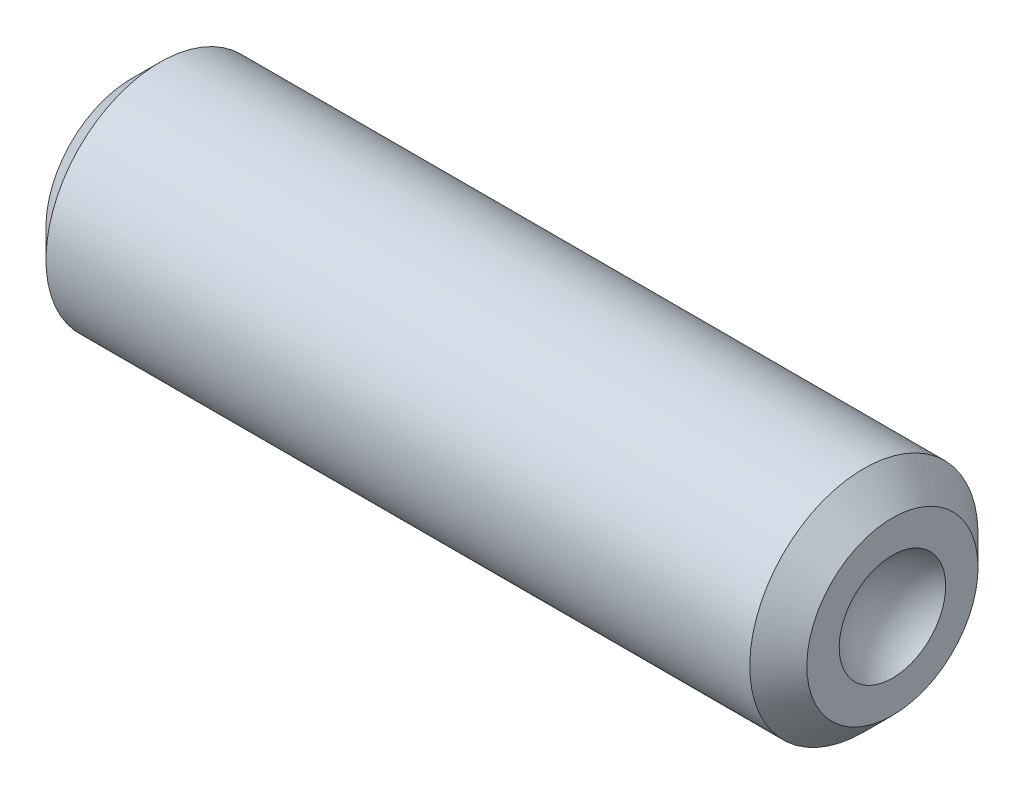
ISO-10303-21;
HEADER;
FILE_DESCRIPTION(('STEP AP214'),'2;1');
FILE_NAME('part.step','',(''),(''),'','','');
FILE_SCHEMA(('AUTOMOTIVE_DESIGN { 1 0 10303 214 1 1 1 1 }'));
ENDSEC;
DATA;
#1=APPLICATION_CONTEXT('core data for automotive mechanical design processes');
#2=APPLICATION_PROTOCOL_DEFINITION('international standard','automotive_design',2000,#1);
#3=PRODUCT_CONTEXT('',#1,'mechanical');
#4=PRODUCT('Part','Part','',(#3));
#5=PRODUCT_RELATED_PRODUCT_CATEGORY('part','',(#4));
#6=PRODUCT_DEFINITION_FORMATION('','',#4);
#7=PRODUCT_DEFINITION_CONTEXT('part definition',#1,'design');
#8=PRODUCT_DEFINITION('design','',#6,#7);
#9=PRODUCT_DEFINITION_SHAPE('','',#8);
#10=(LENGTH_UNIT() NAMED_UNIT(*) SI_UNIT(.MILLI.,.METRE.));
#11=(NAMED_UNIT(*) PLANE_ANGLE_UNIT() SI_UNIT($,.RADIAN.));
#12=(NAMED_UNIT(*) SI_UNIT($,.STERADIAN.) SOLID_ANGLE_UNIT());
#13=UNCERTAINTY_MEASURE_WITH_UNIT(LENGTH_MEASURE(1.E-05),#10,'distance_accuracy_value','');
#14=(GEOMETRIC_REPRESENTATION_CONTEXT(3) GLOBAL_UNCERTAINTY_ASSIGNED_CONTEXT((#13)) GLOBAL_UNIT_ASSIGNED_CONTEXT((#10,
#11,#12)) REPRESENTATION_CONTEXT('',''));
#15=CARTESIAN_POINT('',(0.,0.,0.));
#16=DIRECTION('',(0.,0.,1.));
#17=DIRECTION('',(1.,0.,0.));
#18=AXIS2_PLACEMENT_3D('',#15,#16,#17);
#19=CARTESIAN_POINT('',(0.,0.,0.));
#20=DIRECTION('',(1.,0.,0.));
#21=DIRECTION('',(0.,1.,0.));
#22=AXIS2_PLACEMENT_3D('',#19,#20,#21);
#23=PLANE('',#22);
#24=DIRECTION('',(0.,-0.5,-0.866025403784439));
#25=VECTOR('',#24,1.);
#26=CARTESIAN_POINT('',(0.,0.866025403784439,0.));
#27=LINE('',#26,#25);
#28=CARTESIAN_POINT('',(0.,0.866025403784439,0.));
#29=VERTEX_POINT('',#28);
#30=CARTESIAN_POINT('',(0.,0.43301270189222,-0.75));
#31=VERTEX_POINT('',#30);
#32=EDGE_CURVE('E107',#29,#31,#27,.T.);
#33=ORIENTED_EDGE('',*,*,#32,.F.);
#34=DIRECTION('',(0.,0.5,-0.866025403784439));
#35=VECTOR('',#34,1.);
#36=CARTESIAN_POINT('',(0.,0.433012701892219,0.75));
#37=LINE('',#36,#35);
#38=CARTESIAN_POINT('',(0.,0.433012701892219,0.75));
#39=VERTEX_POINT('',#38);
#40=EDGE_CURVE('E49',#39,#29,#37,.T.);
#41=ORIENTED_EDGE('',*,*,#40,.F.);
#42=DIRECTION('',(0.,1.,0.));
#43=VECTOR('',#42,1.);
#44=CARTESIAN_POINT('',(0.,-0.43301270189222,0.75));
#45=LINE('',#44,#43);
#46=CARTESIAN_POINT('',(0.,-0.43301270189222,0.75));
#47=VERTEX_POINT('',#46);
#48=EDGE_CURVE('E122',#47,#39,#45,.T.);
#49=ORIENTED_EDGE('',*,*,#48,.F.);
#50=DIRECTION('',(0.,0.5,0.866025403784439));
#51=VECTOR('',#50,1.);
#52=CARTESIAN_POINT('',(0.,-0.866025403784439,0.));
#53=LINE('',#52,#51);
#54=CARTESIAN_POINT('',(0.,-0.866025403784439,0.));
#55=VERTEX_POINT('',#54);
#56=EDGE_CURVE('E116',#55,#47,#53,.T.);
#57=ORIENTED_EDGE('',*,*,#56,.F.);
#58=DIRECTION('',(0.,-0.5,0.866025403784439));
#59=VECTOR('',#58,1.);
#60=CARTESIAN_POINT('',(0.,-0.433012701892219,-0.75));
#61=LINE('',#60,#59);
#62=CARTESIAN_POINT('',(0.,-0.433012701892219,-0.75));
#63=VERTEX_POINT('',#62);
#64=EDGE_CURVE('E114',#63,#55,#61,.T.);
#65=ORIENTED_EDGE('',*,*,#64,.F.);
#66=DIRECTION('',(0.,-1.,0.));
#67=VECTOR('',#66,1.);
#68=CARTESIAN_POINT('',(0.,0.43301270189222,-0.75));
#69=LINE('',#68,#67);
#70=EDGE_CURVE('E100',#31,#63,#69,.T.);
#71=ORIENTED_EDGE('',*,*,#70,.F.);
#72=EDGE_LOOP('',(#33,#41,#49,#57,#65,#71));
#73=FACE_BOUND('',#72,.T.);
#74=CARTESIAN_POINT('',(0.,0.,0.));
#75=DIRECTION('',(-1.,0.,0.));
#76=DIRECTION('',(0.,-1.,0.));
#77=AXIS2_PLACEMENT_3D('',#74,#75,#76);
#78=CIRCLE('',#77,1.125);
#79=CARTESIAN_POINT('',(0.,-1.125,0.));
#80=VERTEX_POINT('',#79);
#81=EDGE_CURVE('E12',#80,#80,#78,.T.);
#82=ORIENTED_EDGE('',*,*,#81,.T.);
#83=EDGE_LOOP('',(#82));
#84=FACE_BOUND('',#83,.T.);
#85=ADVANCED_FACE('F35',(#73,#84),#23,.F.);
#86=CARTESIAN_POINT('',(0.375000000000001,0.,0.));
#87=DIRECTION('',(1.,0.,0.));
#88=DIRECTION('',(0.,1.,0.));
#89=AXIS2_PLACEMENT_3D('',#86,#87,#88);
#90=CONICAL_SURFACE('',#89,1.5,0.785398163397447);
#91=ORIENTED_EDGE('',*,*,#81,.F.);
#92=EDGE_LOOP('',(#91));
#93=FACE_BOUND('',#92,.T.);
#94=CARTESIAN_POINT('',(0.375000000000001,0.,0.));
#95=DIRECTION('',(-1.,0.,0.));
#96=DIRECTION('',(0.,-1.,0.));
#97=AXIS2_PLACEMENT_3D('',#94,#95,#96);
#98=CIRCLE('',#97,1.5);
#99=CARTESIAN_POINT('',(0.375000000000001,-1.5,0.));
#100=VERTEX_POINT('',#99);
#101=EDGE_CURVE('E42',#100,#100,#98,.T.);
#102=ORIENTED_EDGE('',*,*,#101,.T.);
#103=EDGE_LOOP('',(#102));
#104=FACE_BOUND('',#103,.T.);
#105=ADVANCED_FACE('F145',(#93,#104),#90,.T.);
#106=CARTESIAN_POINT('',(0.,0.,0.));
#107=DIRECTION('',(-1.,0.,0.));
#108=DIRECTION('',(0.,-1.,0.));
#109=AXIS2_PLACEMENT_3D('',#106,#107,#108);
#110=CYLINDRICAL_SURFACE('',#109,1.5);
#111=ORIENTED_EDGE('',*,*,#101,.F.);
#112=EDGE_LOOP('',(#111));
#113=FACE_BOUND('',#112,.T.);
#114=CARTESIAN_POINT('',(9.625,0.,0.));
#115=DIRECTION('',(-1.,0.,0.));
#116=DIRECTION('',(0.,-1.,0.));
#117=AXIS2_PLACEMENT_3D('',#114,#115,#116);
#118=CIRCLE('',#117,1.5);
#119=CARTESIAN_POINT('',(9.625,-1.5,0.));
#120=VERTEX_POINT('',#119);
#121=EDGE_CURVE('E140',#120,#120,#118,.T.);
#122=ORIENTED_EDGE('',*,*,#121,.T.);
#123=EDGE_LOOP('',(#122));
#124=FACE_BOUND('',#123,.T.);
#125=ADVANCED_FACE('F147',(#113,#124),#110,.T.);
#126=CARTESIAN_POINT('',(10.,0.,0.));
#127=DIRECTION('',(-1.,0.,0.));
#128=DIRECTION('',(0.,-1.,0.));
#129=AXIS2_PLACEMENT_3D('',#126,#127,#128);
#130=CONICAL_SURFACE('',#129,1.125,0.785398163397449);
#131=ORIENTED_EDGE('',*,*,#121,.F.);
#132=EDGE_LOOP('',(#131));
#133=FACE_BOUND('',#132,.T.);
#134=CARTESIAN_POINT('',(10.,0.,0.));
#135=DIRECTION('',(-1.,0.,0.));
#136=DIRECTION('',(0.,-1.,0.));
#137=AXIS2_PLACEMENT_3D('',#134,#135,#136);
#138=CIRCLE('',#137,1.125);
#139=CARTESIAN_POINT('',(10.,-1.125,0.));
#140=VERTEX_POINT('',#139);
#141=EDGE_CURVE('E137',#140,#140,#138,.T.);
#142=ORIENTED_EDGE('',*,*,#141,.T.);
#143=EDGE_LOOP('',(#142));
#144=FACE_BOUND('',#143,.T.);
#145=ADVANCED_FACE('F150',(#133,#144),#130,.T.);
#146=CARTESIAN_POINT('',(10.,1.125,0.));
#147=DIRECTION('',(-1.,0.,0.));
#148=DIRECTION('',(0.,-1.,0.));
#149=AXIS2_PLACEMENT_3D('',#146,#147,#148);
#150=PLANE('',#149);
#151=ORIENTED_EDGE('',*,*,#141,.F.);
#152=EDGE_LOOP('',(#151));
#153=FACE_BOUND('',#152,.T.);
#154=CARTESIAN_POINT('',(10.,0.,0.));
#155=DIRECTION('',(-1.,0.,0.));
#156=DIRECTION('',(0.,-1.,0.));
#157=AXIS2_PLACEMENT_3D('',#154,#155,#156);
#158=CIRCLE('',#157,0.7);
#159=CARTESIAN_POINT('',(10.,-0.7,0.));
#160=VERTEX_POINT('',#159);
#161=EDGE_CURVE('E134',#160,#160,#158,.T.);
#162=ORIENTED_EDGE('',*,*,#161,.T.);
#163=EDGE_LOOP('',(#162));
#164=FACE_BOUND('',#163,.T.);
#165=ADVANCED_FACE('F156',(#153,#164),#150,.F.);
#166=CARTESIAN_POINT('',(10.4658333333333,0.,0.));
#167=DIRECTION('',(-1.,0.,0.));
#168=DIRECTION('',(0.,-1.,0.));
#169=AXIS2_PLACEMENT_3D('',#166,#167,#168);
#170=SPHERICAL_SURFACE('',#169,0.840833333333333);
#171=ORIENTED_EDGE('',*,*,#161,.F.);
#172=EDGE_LOOP('',(#171));
#173=FACE_BOUND('',#172,.T.);
#174=ADVANCED_FACE('F162',(#173),#170,.F.);
#175=CARTESIAN_POINT('',(12.2912878474779,0.433012701892219,0.75));
#176=DIRECTION('',(0.,0.866025403784438,0.5));
#177=DIRECTION('',(0.,-0.5,0.866025403784438));
#178=AXIS2_PLACEMENT_3D('',#175,#176,#177);
#179=PLANE('',#178);
#180=DIRECTION('',(0.,-0.5,0.866025403784438));
#181=VECTOR('',#180,1.);
#182=CARTESIAN_POINT('',(8.,0.433012701892219,0.75));
#183=LINE('',#182,#181);
#184=CARTESIAN_POINT('',(8.,0.866025403784439,0.));
#185=VERTEX_POINT('',#184);
#186=CARTESIAN_POINT('',(8.,0.433012701892219,0.75));
#187=VERTEX_POINT('',#186);
#188=EDGE_CURVE('E68',#185,#187,#183,.T.);
#189=ORIENTED_EDGE('',*,*,#188,.T.);
#190=DIRECTION('',(-1.,0.,0.));
#191=VECTOR('',#190,1.);
#192=CARTESIAN_POINT('',(12.2912878474779,0.433012701892219,0.75));
#193=LINE('',#192,#191);
#194=EDGE_CURVE('E125',#187,#39,#193,.T.);
#195=ORIENTED_EDGE('',*,*,#194,.T.);
#196=ORIENTED_EDGE('',*,*,#40,.T.);
#197=DIRECTION('',(-1.,0.,0.));
#198=VECTOR('',#197,1.);
#199=CARTESIAN_POINT('',(12.2912878474779,0.866025403784439,0.));
#200=LINE('',#199,#198);
#201=EDGE_CURVE('E104',#185,#29,#200,.T.);
#202=ORIENTED_EDGE('',*,*,#201,.F.);
#203=EDGE_LOOP('',(#189,#195,#196,#202));
#204=FACE_BOUND('',#203,.T.);
#205=ADVANCED_FACE('F167',(#204),#179,.F.);
#206=CARTESIAN_POINT('',(12.2912878474779,-0.43301270189222,0.75));
#207=DIRECTION('',(0.,0.,1.));
#208=DIRECTION('',(0.,-1.,0.));
#209=AXIS2_PLACEMENT_3D('',#206,#207,#208);
#210=PLANE('',#209);
#211=DIRECTION('',(0.,-1.,0.));
#212=VECTOR('',#211,1.);
#213=CARTESIAN_POINT('',(8.,-0.43301270189222,0.75));
#214=LINE('',#213,#212);
#215=CARTESIAN_POINT('',(8.,-0.43301270189222,0.75));
#216=VERTEX_POINT('',#215);
#217=EDGE_CURVE('E267',#187,#216,#214,.T.);
#218=ORIENTED_EDGE('',*,*,#217,.T.);
#219=DIRECTION('',(-1.,0.,0.));
#220=VECTOR('',#219,1.);
#221=CARTESIAN_POINT('',(12.2912878474779,-0.43301270189222,0.75));
#222=LINE('',#221,#220);
#223=EDGE_CURVE('E127',#216,#47,#222,.T.);
#224=ORIENTED_EDGE('',*,*,#223,.T.);
#225=ORIENTED_EDGE('',*,*,#48,.T.);
#226=ORIENTED_EDGE('',*,*,#194,.F.);
#227=EDGE_LOOP('',(#218,#224,#225,#226));
#228=FACE_BOUND('',#227,.T.);
#229=ADVANCED_FACE('F172',(#228),#210,.F.);
#230=CARTESIAN_POINT('',(12.2912878474779,-0.866025403784439,0.));
#231=DIRECTION('',(0.,-0.866025403784439,0.5));
#232=DIRECTION('',(0.,-0.5,-0.866025403784439));
#233=AXIS2_PLACEMENT_3D('',#230,#231,#232);
#234=PLANE('',#233);
#235=DIRECTION('',(0.,-0.5,-0.866025403784439));
#236=VECTOR('',#235,1.);
#237=CARTESIAN_POINT('',(8.,-0.866025403784439,0.));
#238=LINE('',#237,#236);
#239=CARTESIAN_POINT('',(8.,-0.866025403784439,0.));
#240=VERTEX_POINT('',#239);
#241=EDGE_CURVE('E270',#216,#240,#238,.T.);
#242=ORIENTED_EDGE('',*,*,#241,.T.);
#243=DIRECTION('',(-1.,0.,0.));
#244=VECTOR('',#243,1.);
#245=CARTESIAN_POINT('',(12.2912878474779,-0.866025403784439,0.));
#246=LINE('',#245,#244);
#247=EDGE_CURVE('E129',#240,#55,#246,.T.);
#248=ORIENTED_EDGE('',*,*,#247,.T.);
#249=ORIENTED_EDGE('',*,*,#56,.T.);
#250=ORIENTED_EDGE('',*,*,#223,.F.);
#251=EDGE_LOOP('',(#242,#248,#249,#250));
#252=FACE_BOUND('',#251,.T.);
#253=ADVANCED_FACE('F217',(#252),#234,.F.);
#254=CARTESIAN_POINT('',(12.2912878474779,-0.43301270189222,-0.75));
#255=DIRECTION('',(0.,-0.866025403784438,-0.5));
#256=DIRECTION('',(0.,0.5,-0.866025403784439));
#257=AXIS2_PLACEMENT_3D('',#254,#255,#256);
#258=PLANE('',#257);
#259=DIRECTION('',(0.,0.5,-0.866025403784439));
#260=VECTOR('',#259,1.);
#261=CARTESIAN_POINT('',(8.,-0.433012701892219,-0.75));
#262=LINE('',#261,#260);
#263=CARTESIAN_POINT('',(8.,-0.433012701892219,-0.75));
#264=VERTEX_POINT('',#263);
#265=EDGE_CURVE('E58',#240,#264,#262,.T.);
#266=ORIENTED_EDGE('',*,*,#265,.T.);
#267=DIRECTION('',(-1.,0.,0.));
#268=VECTOR('',#267,1.);
#269=CARTESIAN_POINT('',(12.2912878474779,-0.43301270189222,-0.75));
#270=LINE('',#269,#268);
#271=EDGE_CURVE('E103',#264,#63,#270,.T.);
#272=ORIENTED_EDGE('',*,*,#271,.T.);
#273=ORIENTED_EDGE('',*,*,#64,.T.);
#274=ORIENTED_EDGE('',*,*,#247,.F.);
#275=EDGE_LOOP('',(#266,#272,#273,#274));
#276=FACE_BOUND('',#275,.T.);
#277=ADVANCED_FACE('F227',(#276),#258,.F.);
#278=CARTESIAN_POINT('',(12.2912878474779,0.43301270189222,-0.75));
#279=DIRECTION('',(0.,0.,-1.));
#280=DIRECTION('',(-1.,0.,0.));
#281=AXIS2_PLACEMENT_3D('',#278,#279,#280);
#282=PLANE('',#281);
#283=DIRECTION('',(0.,1.,0.));
#284=VECTOR('',#283,1.);
#285=CARTESIAN_POINT('',(8.,0.43301270189222,-0.75));
#286=LINE('',#285,#284);
#287=CARTESIAN_POINT('',(8.,0.43301270189222,-0.75));
#288=VERTEX_POINT('',#287);
#289=EDGE_CURVE('E102',#264,#288,#286,.T.);
#290=ORIENTED_EDGE('',*,*,#289,.T.);
#291=DIRECTION('',(-1.,0.,0.));
#292=VECTOR('',#291,1.);
#293=CARTESIAN_POINT('',(12.2912878474779,0.43301270189222,-0.75));
#294=LINE('',#293,#292);
#295=EDGE_CURVE('E95',#288,#31,#294,.T.);
#296=ORIENTED_EDGE('',*,*,#295,.T.);
#297=ORIENTED_EDGE('',*,*,#70,.T.);
#298=ORIENTED_EDGE('',*,*,#271,.F.);
#299=EDGE_LOOP('',(#290,#296,#297,#298));
#300=FACE_BOUND('',#299,.T.);
#301=ADVANCED_FACE('F97',(#300),#282,.F.);
#302=CARTESIAN_POINT('',(12.2912878474779,0.866025403784439,0.));
#303=DIRECTION('',(0.,0.866025403784439,-0.5));
#304=DIRECTION('',(0.,0.5,0.866025403784439));
#305=AXIS2_PLACEMENT_3D('',#302,#303,#304);
#306=PLANE('',#305);
#307=DIRECTION('',(0.,0.5,0.866025403784439));
#308=VECTOR('',#307,1.);
#309=CARTESIAN_POINT('',(8.,0.866025403784439,0.));
#310=LINE('',#309,#308);
#311=EDGE_CURVE('E77',#288,#185,#310,.T.);
#312=ORIENTED_EDGE('',*,*,#311,.T.);
#313=ORIENTED_EDGE('',*,*,#201,.T.);
#314=ORIENTED_EDGE('',*,*,#32,.T.);
#315=ORIENTED_EDGE('',*,*,#295,.F.);
#316=EDGE_LOOP('',(#312,#313,#314,#315));
#317=FACE_BOUND('',#316,.T.);
#318=ADVANCED_FACE('F108',(#317),#306,.F.);
#319=CARTESIAN_POINT('',(8.,1.125,0.));
#320=DIRECTION('',(-1.,0.,0.));
#321=DIRECTION('',(0.,-1.,0.));
#322=AXIS2_PLACEMENT_3D('',#319,#320,#321);
#323=PLANE('',#322);
#324=ORIENTED_EDGE('',*,*,#188,.F.);
#325=ORIENTED_EDGE('',*,*,#311,.F.);
#326=ORIENTED_EDGE('',*,*,#289,.F.);
#327=ORIENTED_EDGE('',*,*,#265,.F.);
#328=ORIENTED_EDGE('',*,*,#241,.F.);
#329=ORIENTED_EDGE('',*,*,#217,.F.);
#330=EDGE_LOOP('',(#324,#325,#326,#327,#328,#329));
#331=FACE_BOUND('',#330,.T.);
#332=ADVANCED_FACE('F253',(#331),#323,.T.);
#333=CLOSED_SHELL('',(#85,#105,#125,#145,#165,#174,#205,#229,#253,#277,#301,#318,#332));
#334=MANIFOLD_SOLID_BREP('B2',#333);
#335=ADVANCED_BREP_SHAPE_REPRESENTATION('',(#18,#334),#14);
#336=SHAPE_DEFINITION_REPRESENTATION(#9,#335);
ENDSEC;
END-ISO-10303-21;
